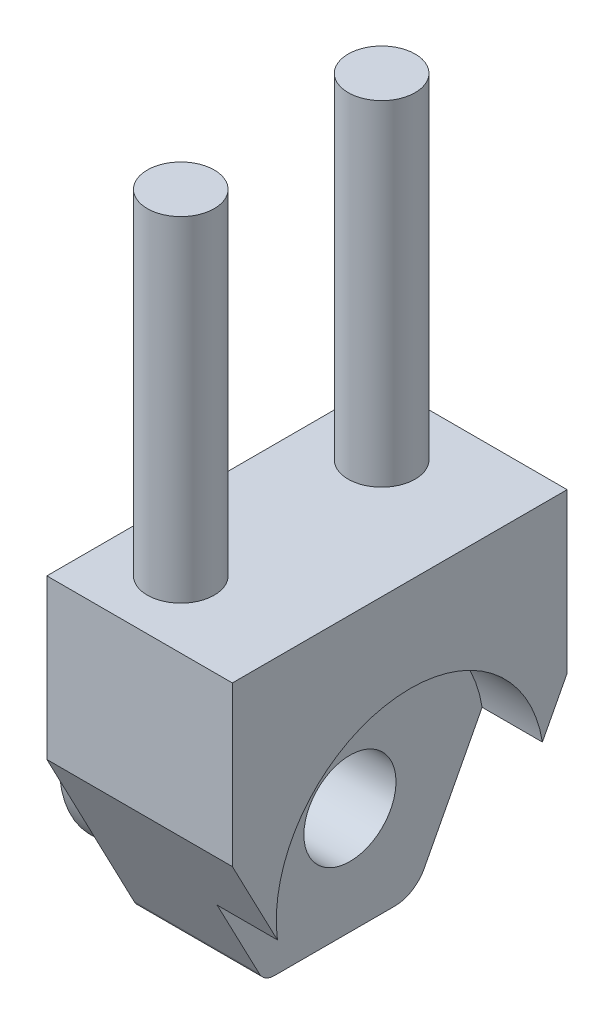
ISO-10303-21;
HEADER;
FILE_DESCRIPTION(('STEP AP214'),'2;1');
FILE_NAME('part.step','',(''),(''),'','','');
FILE_SCHEMA(('AUTOMOTIVE_DESIGN { 1 0 10303 214 1 1 1 1 }'));
ENDSEC;
DATA;
#1=APPLICATION_CONTEXT('core data for automotive mechanical design processes');
#2=APPLICATION_PROTOCOL_DEFINITION('international standard','automotive_design',2000,#1);
#3=PRODUCT_CONTEXT('',#1,'mechanical');
#4=PRODUCT('Part','Part','',(#3));
#5=PRODUCT_RELATED_PRODUCT_CATEGORY('part','',(#4));
#6=PRODUCT_DEFINITION_FORMATION('','',#4);
#7=PRODUCT_DEFINITION_CONTEXT('part definition',#1,'design');
#8=PRODUCT_DEFINITION('design','',#6,#7);
#9=PRODUCT_DEFINITION_SHAPE('','',#8);
#10=(LENGTH_UNIT() NAMED_UNIT(*) SI_UNIT(.MILLI.,.METRE.));
#11=(NAMED_UNIT(*) PLANE_ANGLE_UNIT() SI_UNIT($,.RADIAN.));
#12=(NAMED_UNIT(*) SI_UNIT($,.STERADIAN.) SOLID_ANGLE_UNIT());
#13=UNCERTAINTY_MEASURE_WITH_UNIT(LENGTH_MEASURE(1.E-05),#10,'distance_accuracy_value','');
#14=(GEOMETRIC_REPRESENTATION_CONTEXT(3) GLOBAL_UNCERTAINTY_ASSIGNED_CONTEXT((#13)) GLOBAL_UNIT_ASSIGNED_CONTEXT((#10,
#11,#12)) REPRESENTATION_CONTEXT('',''));
#15=CARTESIAN_POINT('',(0.,0.,0.));
#16=DIRECTION('',(0.,0.,1.));
#17=DIRECTION('',(1.,0.,0.));
#18=AXIS2_PLACEMENT_3D('',#15,#16,#17);
#19=CARTESIAN_POINT('',(30.7741068663053,12.8,-1.61793004647283));
#20=DIRECTION('',(1.,0.,0.));
#21=DIRECTION('',(0.,0.,1.));
#22=AXIS2_PLACEMENT_3D('',#19,#20,#21);
#23=PLANE('',#22);
#24=DIRECTION('',(0.,0.,1.));
#25=VECTOR('',#24,1.);
#26=CARTESIAN_POINT('',(30.7741068663053,0.,0.));
#27=LINE('',#26,#25);
#28=CARTESIAN_POINT('',(30.7741068663053,0.,-6.94763686889959));
#29=VERTEX_POINT('',#28);
#30=CARTESIAN_POINT('',(30.7741068663053,0.,7.42192336474054));
#31=VERTEX_POINT('',#30);
#32=EDGE_CURVE('E230',#29,#31,#27,.T.);
#33=ORIENTED_EDGE('',*,*,#32,.F.);
#34=CARTESIAN_POINT('',(30.7741068663053,4.,-6.94763686889959));
#35=DIRECTION('',(-1.,0.,0.));
#36=DIRECTION('',(0.,0.,1.));
#37=AXIS2_PLACEMENT_3D('',#34,#35,#36);
#38=CIRCLE('',#37,4.);
#39=CARTESIAN_POINT('',(30.7741068663053,2.14397202131778,-10.4909630100202));
#40=VERTEX_POINT('',#39);
#41=EDGE_CURVE('E162',#29,#40,#38,.F.);
#42=ORIENTED_EDGE('',*,*,#41,.T.);
#43=DIRECTION('',(0.,-0.885831535280157,0.464006994670556));
#44=VECTOR('',#43,1.);
#45=CARTESIAN_POINT('',(30.7741068663053,21.0000000000001,-20.3679300464728));
#46=LINE('',#45,#44);
#47=CARTESIAN_POINT('',(30.7741068663053,15.3573140445786,-17.4122374031568));
#48=VERTEX_POINT('',#47);
#49=EDGE_CURVE('E202',#40,#48,#46,.F.);
#50=ORIENTED_EDGE('',*,*,#49,.T.);
#51=CARTESIAN_POINT('',(30.7741068663053,12.8,-1.61793004647283));
#52=DIRECTION('',(-1.,0.,0.));
#53=DIRECTION('',(0.,0.,1.));
#54=AXIS2_PLACEMENT_3D('',#51,#52,#53);
#55=CIRCLE('',#54,16.);
#56=CARTESIAN_POINT('',(30.7741068663053,10.7174168179879,14.2459549534255));
#57=VERTEX_POINT('',#56);
#58=EDGE_CURVE('E117',#57,#48,#55,.T.);
#59=ORIENTED_EDGE('',*,*,#58,.F.);
#60=DIRECTION('',(0.,0.885831535280156,0.464006994670556));
#61=VECTOR('',#60,1.);
#62=CARTESIAN_POINT('',(30.7741068663053,21.0000000000001,19.6320699535272));
#63=LINE('',#62,#61);
#64=CARTESIAN_POINT('',(30.7741068663053,1.07198601065888,9.19358643530085));
#65=VERTEX_POINT('',#64);
#66=EDGE_CURVE('E123',#57,#65,#63,.F.);
#67=ORIENTED_EDGE('',*,*,#66,.T.);
#68=CARTESIAN_POINT('',(30.7741068663053,2.,7.42192336474054));
#69=DIRECTION('',(-1.,0.,0.));
#70=DIRECTION('',(0.,0.,1.));
#71=AXIS2_PLACEMENT_3D('',#68,#69,#70);
#72=CIRCLE('',#71,2.);
#73=EDGE_CURVE('E169',#31,#65,#72,.T.);
#74=ORIENTED_EDGE('',*,*,#73,.F.);
#75=EDGE_LOOP('',(#33,#42,#50,#59,#67,#74));
#76=FACE_BOUND('',#75,.T.);
#77=CARTESIAN_POINT('',(30.7741068663053,12.8,-1.61793004647283));
#78=DIRECTION('',(-1.,0.,0.));
#79=DIRECTION('',(0.,0.,1.));
#80=AXIS2_PLACEMENT_3D('',#77,#78,#79);
#81=CIRCLE('',#80,5.5);
#82=CARTESIAN_POINT('',(30.7741068663053,12.8,3.88206995352717));
#83=VERTEX_POINT('',#82);
#84=EDGE_CURVE('E39',#83,#83,#81,.F.);
#85=ORIENTED_EDGE('',*,*,#84,.F.);
#86=EDGE_LOOP('',(#85));
#87=FACE_BOUND('',#86,.T.);
#88=ADVANCED_FACE('F35',(#76,#87),#23,.T.);
#89=CARTESIAN_POINT('',(0.,0.,0.));
#90=DIRECTION('',(0.,1.,0.));
#91=DIRECTION('',(0.,0.,-1.));
#92=AXIS2_PLACEMENT_3D('',#89,#90,#91);
#93=PLANE('',#92);
#94=DIRECTION('',(0.,0.,-1.));
#95=VECTOR('',#94,1.);
#96=CARTESIAN_POINT('',(15.8141068663053,0.,19.6320699535272));
#97=LINE('',#96,#95);
#98=CARTESIAN_POINT('',(15.8141068663053,0.,7.42192336474054));
#99=VERTEX_POINT('',#98);
#100=CARTESIAN_POINT('',(15.8141068663053,0.,-6.94763686889959));
#101=VERTEX_POINT('',#100);
#102=EDGE_CURVE('E194',#99,#101,#97,.T.);
#103=ORIENTED_EDGE('',*,*,#102,.T.);
#104=DIRECTION('',(1.,0.,0.));
#105=VECTOR('',#104,1.);
#106=CARTESIAN_POINT('',(15.8141068663053,0.,-6.94763686889959));
#107=LINE('',#106,#105);
#108=EDGE_CURVE('E151',#29,#101,#107,.F.);
#109=ORIENTED_EDGE('',*,*,#108,.F.);
#110=ORIENTED_EDGE('',*,*,#32,.T.);
#111=DIRECTION('',(-1.,0.,0.));
#112=VECTOR('',#111,1.);
#113=CARTESIAN_POINT('',(30.7741068663053,0.,7.42192336474054));
#114=LINE('',#113,#112);
#115=EDGE_CURVE('E167',#99,#31,#114,.F.);
#116=ORIENTED_EDGE('',*,*,#115,.F.);
#117=EDGE_LOOP('',(#103,#109,#110,#116));
#118=FACE_BOUND('',#117,.T.);
#119=ADVANCED_FACE('F264',(#118),#93,.F.);
#120=CARTESIAN_POINT('',(15.8141068663053,21.0000000000001,19.6320699535272));
#121=DIRECTION('',(0.,0.464006994670556,-0.885831535280156));
#122=DIRECTION('',(-1.,0.,0.));
#123=AXIS2_PLACEMENT_3D('',#120,#121,#122);
#124=PLANE('',#123);
#125=ORIENTED_EDGE('',*,*,#66,.F.);
#126=DIRECTION('',(1.,0.,0.));
#127=VECTOR('',#126,1.);
#128=CARTESIAN_POINT('',(30.7741068663053,10.7174168179879,14.2459549534255));
#129=LINE('',#128,#127);
#130=CARTESIAN_POINT('',(37.9741068663053,10.7174168179879,14.2459549534255));
#131=VERTEX_POINT('',#130);
#132=EDGE_CURVE('E165',#57,#131,#129,.T.);
#133=ORIENTED_EDGE('',*,*,#132,.T.);
#134=DIRECTION('',(0.,-0.885831535280156,-0.464006994670556));
#135=VECTOR('',#134,1.);
#136=CARTESIAN_POINT('',(37.9741068663053,21.0000000000001,19.6320699535272));
#137=LINE('',#136,#135);
#138=CARTESIAN_POINT('',(37.9741068663053,21.0000000000001,19.6320699535272));
#139=VERTEX_POINT('',#138);
#140=EDGE_CURVE('E131',#131,#139,#137,.F.);
#141=ORIENTED_EDGE('',*,*,#140,.T.);
#142=DIRECTION('',(-1.,0.,0.));
#143=VECTOR('',#142,1.);
#144=CARTESIAN_POINT('',(15.8141068663053,21.0000000000001,19.6320699535272));
#145=LINE('',#144,#143);
#146=CARTESIAN_POINT('',(15.8141068663053,21.0000000000001,19.6320699535272));
#147=VERTEX_POINT('',#146);
#148=EDGE_CURVE('E140',#139,#147,#145,.T.);
#149=ORIENTED_EDGE('',*,*,#148,.T.);
#150=DIRECTION('',(0.,0.885831535280156,0.464006994670556));
#151=VECTOR('',#150,1.);
#152=CARTESIAN_POINT('',(15.8141068663053,21.0000000000001,19.6320699535272));
#153=LINE('',#152,#151);
#154=CARTESIAN_POINT('',(15.8141068663053,1.07198601065888,9.19358643530085));
#155=VERTEX_POINT('',#154);
#156=EDGE_CURVE('E148',#147,#155,#153,.F.);
#157=ORIENTED_EDGE('',*,*,#156,.T.);
#158=DIRECTION('',(1.,0.,0.));
#159=VECTOR('',#158,1.);
#160=CARTESIAN_POINT('',(15.8141068663053,1.07198601065889,9.19358643530085));
#161=LINE('',#160,#159);
#162=EDGE_CURVE('E44',#65,#155,#161,.F.);
#163=ORIENTED_EDGE('',*,*,#162,.F.);
#164=EDGE_LOOP('',(#125,#133,#141,#149,#157,#163));
#165=FACE_BOUND('',#164,.T.);
#166=ADVANCED_FACE('F175',(#165),#124,.F.);
#167=CARTESIAN_POINT('',(37.9741068663053,40.,19.6320699535272));
#168=DIRECTION('',(-1.,0.,0.));
#169=DIRECTION('',(0.,0.,-1.));
#170=AXIS2_PLACEMENT_3D('',#167,#168,#169);
#171=PLANE('',#170);
#172=DIRECTION('',(0.,0.885831535280157,-0.464006994670556));
#173=VECTOR('',#172,1.);
#174=CARTESIAN_POINT('',(37.9741068663053,21.0000000000001,-20.3679300464728));
#175=LINE('',#174,#173);
#176=CARTESIAN_POINT('',(37.9741068663053,21.0000000000002,-20.3679300464728));
#177=VERTEX_POINT('',#176);
#178=CARTESIAN_POINT('',(37.9741068663053,15.3573140445786,-17.4122374031568));
#179=VERTEX_POINT('',#178);
#180=EDGE_CURVE('E129',#177,#179,#175,.F.);
#181=ORIENTED_EDGE('',*,*,#180,.F.);
#182=DIRECTION('',(0.,-1.,0.));
#183=VECTOR('',#182,1.);
#184=CARTESIAN_POINT('',(37.9741068663053,40.,-20.3679300464728));
#185=LINE('',#184,#183);
#186=CARTESIAN_POINT('',(37.9741068663053,40.,-20.3679300464728));
#187=VERTEX_POINT('',#186);
#188=EDGE_CURVE('E189',#187,#177,#185,.T.);
#189=ORIENTED_EDGE('',*,*,#188,.F.);
#190=DIRECTION('',(0.,0.,1.));
#191=VECTOR('',#190,1.);
#192=CARTESIAN_POINT('',(37.9741068663053,40.,19.6320699535272));
#193=LINE('',#192,#191);
#194=CARTESIAN_POINT('',(37.9741068663053,40.,19.6320699535272));
#195=VERTEX_POINT('',#194);
#196=EDGE_CURVE('E191',#187,#195,#193,.T.);
#197=ORIENTED_EDGE('',*,*,#196,.T.);
#198=DIRECTION('',(0.,-1.,0.));
#199=VECTOR('',#198,1.);
#200=CARTESIAN_POINT('',(37.9741068663053,40.,19.6320699535272));
#201=LINE('',#200,#199);
#202=EDGE_CURVE('E186',#195,#139,#201,.T.);
#203=ORIENTED_EDGE('',*,*,#202,.T.);
#204=ORIENTED_EDGE('',*,*,#140,.F.);
#205=CARTESIAN_POINT('',(37.9741068663053,12.8,-1.61793004647283));
#206=DIRECTION('',(-1.,0.,0.));
#207=DIRECTION('',(0.,0.,1.));
#208=AXIS2_PLACEMENT_3D('',#205,#206,#207);
#209=CIRCLE('',#208,16.);
#210=EDGE_CURVE('E114',#131,#179,#209,.T.);
#211=ORIENTED_EDGE('',*,*,#210,.T.);
#212=EDGE_LOOP('',(#181,#189,#197,#203,#204,#211));
#213=FACE_BOUND('',#212,.T.);
#214=ADVANCED_FACE('F127',(#213),#171,.F.);
#215=CARTESIAN_POINT('',(0.,4.,-6.94763686889959));
#216=DIRECTION('',(-1.,0.,0.));
#217=DIRECTION('',(0.,0.,-1.));
#218=AXIS2_PLACEMENT_3D('',#215,#216,#217);
#219=CYLINDRICAL_SURFACE('',#218,4.);
#220=ORIENTED_EDGE('',*,*,#108,.T.);
#221=CARTESIAN_POINT('',(15.8141068663053,4.,-6.94763686889959));
#222=DIRECTION('',(-1.,0.,0.));
#223=DIRECTION('',(0.,0.,1.));
#224=AXIS2_PLACEMENT_3D('',#221,#222,#223);
#225=CIRCLE('',#224,4.);
#226=CARTESIAN_POINT('',(15.8141068663053,2.14397202131777,-10.4909630100202));
#227=VERTEX_POINT('',#226);
#228=EDGE_CURVE('E154',#101,#227,#225,.F.);
#229=ORIENTED_EDGE('',*,*,#228,.T.);
#230=DIRECTION('',(-1.,0.,0.));
#231=VECTOR('',#230,1.);
#232=CARTESIAN_POINT('',(37.9741068663053,2.14397202131778,-10.4909630100202));
#233=LINE('',#232,#231);
#234=EDGE_CURVE('E157',#227,#40,#233,.F.);
#235=ORIENTED_EDGE('',*,*,#234,.T.);
#236=ORIENTED_EDGE('',*,*,#41,.F.);
#237=EDGE_LOOP('',(#220,#229,#235,#236));
#238=FACE_BOUND('',#237,.T.);
#239=ADVANCED_FACE('F205',(#238),#219,.T.);
#240=CARTESIAN_POINT('',(15.8141068663053,40.,19.6320699535272));
#241=DIRECTION('',(1.,0.,0.));
#242=DIRECTION('',(0.,0.,1.));
#243=AXIS2_PLACEMENT_3D('',#240,#241,#242);
#244=PLANE('',#243);
#245=ORIENTED_EDGE('',*,*,#156,.F.);
#246=DIRECTION('',(0.,-1.,0.));
#247=VECTOR('',#246,1.);
#248=CARTESIAN_POINT('',(15.8141068663053,40.,19.6320699535272));
#249=LINE('',#248,#247);
#250=CARTESIAN_POINT('',(15.8141068663053,40.,19.6320699535272));
#251=VERTEX_POINT('',#250);
#252=EDGE_CURVE('E181',#251,#147,#249,.T.);
#253=ORIENTED_EDGE('',*,*,#252,.F.);
#254=DIRECTION('',(0.,0.,-1.));
#255=VECTOR('',#254,1.);
#256=CARTESIAN_POINT('',(15.8141068663053,40.,19.6320699535272));
#257=LINE('',#256,#255);
#258=CARTESIAN_POINT('',(15.8141068663053,40.,-20.3679300464728));
#259=VERTEX_POINT('',#258);
#260=EDGE_CURVE('E184',#251,#259,#257,.T.);
#261=ORIENTED_EDGE('',*,*,#260,.T.);
#262=DIRECTION('',(0.,-1.,0.));
#263=VECTOR('',#262,1.);
#264=CARTESIAN_POINT('',(15.8141068663053,40.,-20.3679300464728));
#265=LINE('',#264,#263);
#266=CARTESIAN_POINT('',(15.8141068663053,21.0000000000002,-20.3679300464728));
#267=VERTEX_POINT('',#266);
#268=EDGE_CURVE('E142',#259,#267,#265,.T.);
#269=ORIENTED_EDGE('',*,*,#268,.T.);
#270=DIRECTION('',(0.,-0.885831535280157,0.464006994670556));
#271=VECTOR('',#270,1.);
#272=CARTESIAN_POINT('',(15.8141068663053,21.0000000000001,-20.3679300464728));
#273=LINE('',#272,#271);
#274=EDGE_CURVE('E138',#227,#267,#273,.F.);
#275=ORIENTED_EDGE('',*,*,#274,.F.);
#276=ORIENTED_EDGE('',*,*,#228,.F.);
#277=ORIENTED_EDGE('',*,*,#102,.F.);
#278=CARTESIAN_POINT('',(15.8141068663053,2.,7.42192336474054));
#279=DIRECTION('',(-1.,0.,0.));
#280=DIRECTION('',(0.,0.,1.));
#281=AXIS2_PLACEMENT_3D('',#278,#279,#280);
#282=CIRCLE('',#281,2.);
#283=EDGE_CURVE('E11',#155,#99,#282,.F.);
#284=ORIENTED_EDGE('',*,*,#283,.F.);
#285=EDGE_LOOP('',(#245,#253,#261,#269,#275,#276,#277,#284));
#286=FACE_BOUND('',#285,.T.);
#287=CARTESIAN_POINT('',(15.8141068663053,13.5,-0.367930046472834));
#288=DIRECTION('',(-1.,0.,0.));
#289=DIRECTION('',(0.,0.,1.));
#290=AXIS2_PLACEMENT_3D('',#287,#288,#289);
#291=CIRCLE('',#290,12.5);
#292=CARTESIAN_POINT('',(15.8141068663053,13.5,12.1320699535272));
#293=VERTEX_POINT('',#292);
#294=EDGE_CURVE('E159',#293,#293,#291,.F.);
#295=ORIENTED_EDGE('',*,*,#294,.T.);
#296=EDGE_LOOP('',(#295));
#297=FACE_BOUND('',#296,.T.);
#298=ADVANCED_FACE('F178',(#286,#297),#244,.F.);
#299=CARTESIAN_POINT('',(0.,40.,0.));
#300=DIRECTION('',(0.,1.,0.));
#301=DIRECTION('',(0.,0.,-1.));
#302=AXIS2_PLACEMENT_3D('',#299,#300,#301);
#303=PLANE('',#302);
#304=CARTESIAN_POINT('',(23.8141068663053,40.,11.6320699535272));
#305=DIRECTION('',(0.,-1.,0.));
#306=DIRECTION('',(0.,0.,-1.));
#307=AXIS2_PLACEMENT_3D('',#304,#305,#306);
#308=CIRCLE('',#307,4.);
#309=CARTESIAN_POINT('',(23.8141068663053,40.,7.63206995352717));
#310=VERTEX_POINT('',#309);
#311=EDGE_CURVE('E211',#310,#310,#308,.T.);
#312=ORIENTED_EDGE('',*,*,#311,.T.);
#313=EDGE_LOOP('',(#312));
#314=FACE_BOUND('',#313,.T.);
#315=ORIENTED_EDGE('',*,*,#260,.F.);
#316=DIRECTION('',(-1.,0.,0.));
#317=VECTOR('',#316,1.);
#318=CARTESIAN_POINT('',(15.8141068663053,40.,19.6320699535272));
#319=LINE('',#318,#317);
#320=EDGE_CURVE('E187',#195,#251,#319,.T.);
#321=ORIENTED_EDGE('',*,*,#320,.F.);
#322=ORIENTED_EDGE('',*,*,#196,.F.);
#323=DIRECTION('',(1.,0.,0.));
#324=VECTOR('',#323,1.);
#325=CARTESIAN_POINT('',(15.8141068663053,40.,-20.3679300464728));
#326=LINE('',#325,#324);
#327=EDGE_CURVE('E200',#259,#187,#326,.T.);
#328=ORIENTED_EDGE('',*,*,#327,.F.);
#329=EDGE_LOOP('',(#315,#321,#322,#328));
#330=FACE_BOUND('',#329,.T.);
#331=CARTESIAN_POINT('',(23.8141068663053,40.,-12.3679300464728));
#332=DIRECTION('',(0.,-1.,0.));
#333=DIRECTION('',(0.,0.,-1.));
#334=AXIS2_PLACEMENT_3D('',#331,#332,#333);
#335=CIRCLE('',#334,4.);
#336=CARTESIAN_POINT('',(23.8141068663053,40.,-16.3679300464728));
#337=VERTEX_POINT('',#336);
#338=EDGE_CURVE('E219',#337,#337,#335,.T.);
#339=ORIENTED_EDGE('',*,*,#338,.T.);
#340=EDGE_LOOP('',(#339));
#341=FACE_BOUND('',#340,.T.);
#342=ADVANCED_FACE('F226',(#314,#330,#341),#303,.T.);
#343=CARTESIAN_POINT('',(15.8141068663053,40.,-20.3679300464728));
#344=DIRECTION('',(0.,0.,1.));
#345=DIRECTION('',(-1.,0.,0.));
#346=AXIS2_PLACEMENT_3D('',#343,#344,#345);
#347=PLANE('',#346);
#348=ORIENTED_EDGE('',*,*,#268,.F.);
#349=ORIENTED_EDGE('',*,*,#327,.T.);
#350=ORIENTED_EDGE('',*,*,#188,.T.);
#351=DIRECTION('',(1.,0.,0.));
#352=VECTOR('',#351,1.);
#353=CARTESIAN_POINT('',(15.8141068663053,21.0000000000001,-20.3679300464728));
#354=LINE('',#353,#352);
#355=EDGE_CURVE('E136',#267,#177,#354,.T.);
#356=ORIENTED_EDGE('',*,*,#355,.F.);
#357=EDGE_LOOP('',(#348,#349,#350,#356));
#358=FACE_BOUND('',#357,.T.);
#359=ADVANCED_FACE('F199',(#358),#347,.F.);
#360=CARTESIAN_POINT('',(15.8141068663053,40.,19.6320699535272));
#361=DIRECTION('',(0.,0.,-1.));
#362=DIRECTION('',(1.,0.,0.));
#363=AXIS2_PLACEMENT_3D('',#360,#361,#362);
#364=PLANE('',#363);
#365=ORIENTED_EDGE('',*,*,#202,.F.);
#366=ORIENTED_EDGE('',*,*,#320,.T.);
#367=ORIENTED_EDGE('',*,*,#252,.T.);
#368=ORIENTED_EDGE('',*,*,#148,.F.);
#369=EDGE_LOOP('',(#365,#366,#367,#368));
#370=FACE_BOUND('',#369,.T.);
#371=ADVANCED_FACE('F228',(#370),#364,.F.);
#372=CARTESIAN_POINT('',(15.8141068663053,21.0000000000001,-20.3679300464728));
#373=DIRECTION('',(0.,0.464006994670556,0.885831535280156));
#374=DIRECTION('',(1.,0.,0.));
#375=AXIS2_PLACEMENT_3D('',#372,#373,#374);
#376=PLANE('',#375);
#377=DIRECTION('',(1.,0.,0.));
#378=VECTOR('',#377,1.);
#379=CARTESIAN_POINT('',(30.7741068663053,15.3573140445786,-17.4122374031568));
#380=LINE('',#379,#378);
#381=EDGE_CURVE('E111',#179,#48,#380,.F.);
#382=ORIENTED_EDGE('',*,*,#381,.T.);
#383=ORIENTED_EDGE('',*,*,#49,.F.);
#384=ORIENTED_EDGE('',*,*,#234,.F.);
#385=ORIENTED_EDGE('',*,*,#274,.T.);
#386=ORIENTED_EDGE('',*,*,#355,.T.);
#387=ORIENTED_EDGE('',*,*,#180,.T.);
#388=EDGE_LOOP('',(#382,#383,#384,#385,#386,#387));
#389=FACE_BOUND('',#388,.T.);
#390=ADVANCED_FACE('F134',(#389),#376,.F.);
#391=CARTESIAN_POINT('',(23.8141068663053,80.,11.6320699535272));
#392=DIRECTION('',(0.,-1.,0.));
#393=DIRECTION('',(0.,0.,1.));
#394=AXIS2_PLACEMENT_3D('',#391,#392,#393);
#395=CYLINDRICAL_SURFACE('',#394,4.);
#396=CARTESIAN_POINT('',(23.8141068663053,80.,11.6320699535272));
#397=DIRECTION('',(0.,-1.,0.));
#398=DIRECTION('',(0.,0.,-1.));
#399=AXIS2_PLACEMENT_3D('',#396,#397,#398);
#400=CIRCLE('',#399,4.);
#401=CARTESIAN_POINT('',(23.8141068663053,80.,7.63206995352717));
#402=VERTEX_POINT('',#401);
#403=EDGE_CURVE('E208',#402,#402,#400,.T.);
#404=ORIENTED_EDGE('',*,*,#403,.T.);
#405=EDGE_LOOP('',(#404));
#406=FACE_BOUND('',#405,.T.);
#407=ORIENTED_EDGE('',*,*,#311,.F.);
#408=EDGE_LOOP('',(#407));
#409=FACE_BOUND('',#408,.T.);
#410=ADVANCED_FACE('F260',(#406,#409),#395,.T.);
#411=CARTESIAN_POINT('',(23.8141068663053,80.,11.6320699535272));
#412=DIRECTION('',(0.,1.,0.));
#413=DIRECTION('',(0.,0.,-1.));
#414=AXIS2_PLACEMENT_3D('',#411,#412,#413);
#415=PLANE('',#414);
#416=ORIENTED_EDGE('',*,*,#403,.F.);
#417=EDGE_LOOP('',(#416));
#418=FACE_BOUND('',#417,.T.);
#419=ADVANCED_FACE('F251',(#418),#415,.T.);
#420=CARTESIAN_POINT('',(23.8141068663053,80.,-12.3679300464728));
#421=DIRECTION('',(0.,-1.,0.));
#422=DIRECTION('',(0.,0.,1.));
#423=AXIS2_PLACEMENT_3D('',#420,#421,#422);
#424=CYLINDRICAL_SURFACE('',#423,4.);
#425=CARTESIAN_POINT('',(23.8141068663053,80.,-12.3679300464728));
#426=DIRECTION('',(0.,-1.,0.));
#427=DIRECTION('',(0.,0.,-1.));
#428=AXIS2_PLACEMENT_3D('',#425,#426,#427);
#429=CIRCLE('',#428,4.);
#430=CARTESIAN_POINT('',(23.8141068663053,80.,-16.3679300464728));
#431=VERTEX_POINT('',#430);
#432=EDGE_CURVE('E216',#431,#431,#429,.T.);
#433=ORIENTED_EDGE('',*,*,#432,.T.);
#434=EDGE_LOOP('',(#433));
#435=FACE_BOUND('',#434,.T.);
#436=ORIENTED_EDGE('',*,*,#338,.F.);
#437=EDGE_LOOP('',(#436));
#438=FACE_BOUND('',#437,.T.);
#439=ADVANCED_FACE('F248',(#435,#438),#424,.T.);
#440=CARTESIAN_POINT('',(23.8141068663053,80.,-12.3679300464728));
#441=DIRECTION('',(0.,1.,0.));
#442=DIRECTION('',(0.,0.,-1.));
#443=AXIS2_PLACEMENT_3D('',#440,#441,#442);
#444=PLANE('',#443);
#445=ORIENTED_EDGE('',*,*,#432,.F.);
#446=EDGE_LOOP('',(#445));
#447=FACE_BOUND('',#446,.T.);
#448=ADVANCED_FACE('F250',(#447),#444,.T.);
#449=CARTESIAN_POINT('',(9.81410686630526,13.5,-0.367930046472835));
#450=DIRECTION('',(1.,0.,0.));
#451=DIRECTION('',(0.,0.,1.));
#452=AXIS2_PLACEMENT_3D('',#449,#450,#451);
#453=CYLINDRICAL_SURFACE('',#452,12.5);
#454=CARTESIAN_POINT('',(9.81410686630526,13.5,-0.367930046472835));
#455=DIRECTION('',(1.,0.,0.));
#456=DIRECTION('',(0.,0.,-1.));
#457=AXIS2_PLACEMENT_3D('',#454,#455,#456);
#458=CIRCLE('',#457,12.5);
#459=CARTESIAN_POINT('',(9.81410686630526,13.5,-12.8679300464728));
#460=VERTEX_POINT('',#459);
#461=EDGE_CURVE('E122',#460,#460,#458,.T.);
#462=ORIENTED_EDGE('',*,*,#461,.T.);
#463=EDGE_LOOP('',(#462));
#464=FACE_BOUND('',#463,.T.);
#465=ORIENTED_EDGE('',*,*,#294,.F.);
#466=EDGE_LOOP('',(#465));
#467=FACE_BOUND('',#466,.T.);
#468=ADVANCED_FACE('F257',(#464,#467),#453,.T.);
#469=CARTESIAN_POINT('',(9.81410686630526,13.5,-0.367930046472835));
#470=DIRECTION('',(-1.,0.,0.));
#471=DIRECTION('',(0.,0.,-1.));
#472=AXIS2_PLACEMENT_3D('',#469,#470,#471);
#473=PLANE('',#472);
#474=ORIENTED_EDGE('',*,*,#461,.F.);
#475=EDGE_LOOP('',(#474));
#476=FACE_BOUND('',#475,.T.);
#477=ADVANCED_FACE('F276',(#476),#473,.T.);
#478=CARTESIAN_POINT('',(30.7741068663053,12.8,-1.61793004647283));
#479=DIRECTION('',(1.,0.,0.));
#480=DIRECTION('',(0.,0.,1.));
#481=AXIS2_PLACEMENT_3D('',#478,#479,#480);
#482=CYLINDRICAL_SURFACE('',#481,16.);
#483=ORIENTED_EDGE('',*,*,#381,.F.);
#484=ORIENTED_EDGE('',*,*,#210,.F.);
#485=ORIENTED_EDGE('',*,*,#132,.F.);
#486=ORIENTED_EDGE('',*,*,#58,.T.);
#487=EDGE_LOOP('',(#483,#484,#485,#486));
#488=FACE_BOUND('',#487,.T.);
#489=ADVANCED_FACE('F113',(#488),#482,.F.);
#490=CARTESIAN_POINT('',(0.,2.,7.42192336474054));
#491=DIRECTION('',(1.,0.,0.));
#492=DIRECTION('',(0.,0.,1.));
#493=AXIS2_PLACEMENT_3D('',#490,#491,#492);
#494=CYLINDRICAL_SURFACE('',#493,2.);
#495=ORIENTED_EDGE('',*,*,#283,.T.);
#496=ORIENTED_EDGE('',*,*,#115,.T.);
#497=ORIENTED_EDGE('',*,*,#73,.T.);
#498=ORIENTED_EDGE('',*,*,#162,.T.);
#499=EDGE_LOOP('',(#495,#496,#497,#498));
#500=FACE_BOUND('',#499,.T.);
#501=ADVANCED_FACE('F37',(#500),#494,.T.);
#502=CARTESIAN_POINT('',(22.9741068663053,12.8,-1.61793004647283));
#503=DIRECTION('',(1.,0.,0.));
#504=DIRECTION('',(0.,0.,1.));
#505=AXIS2_PLACEMENT_3D('',#502,#503,#504);
#506=CYLINDRICAL_SURFACE('',#505,5.5);
#507=ORIENTED_EDGE('',*,*,#84,.T.);
#508=EDGE_LOOP('',(#507));
#509=FACE_BOUND('',#508,.T.);
#510=CARTESIAN_POINT('',(22.9741068663053,12.8,-1.61793004647283));
#511=DIRECTION('',(1.,0.,0.));
#512=DIRECTION('',(0.,0.,-1.));
#513=AXIS2_PLACEMENT_3D('',#510,#511,#512);
#514=CIRCLE('',#513,5.5);
#515=CARTESIAN_POINT('',(22.9741068663053,12.8,-7.11793004647283));
#516=VERTEX_POINT('',#515);
#517=EDGE_CURVE('E237',#516,#516,#514,.T.);
#518=ORIENTED_EDGE('',*,*,#517,.F.);
#519=EDGE_LOOP('',(#518));
#520=FACE_BOUND('',#519,.T.);
#521=ADVANCED_FACE('F272',(#509,#520),#506,.F.);
#522=CARTESIAN_POINT('',(22.9741068663053,12.8,-1.61793004647283));
#523=DIRECTION('',(-1.,0.,0.));
#524=DIRECTION('',(0.,0.,-1.));
#525=AXIS2_PLACEMENT_3D('',#522,#523,#524);
#526=PLANE('',#525);
#527=ORIENTED_EDGE('',*,*,#517,.T.);
#528=EDGE_LOOP('',(#527));
#529=FACE_BOUND('',#528,.T.);
#530=ADVANCED_FACE('F362',(#529),#526,.F.);
#531=CLOSED_SHELL('',(#88,#119,#166,#214,#239,#298,#342,#359,#371,#390,#410,#419,#439,#448,#468,
#477,#489,#501,#521,#530));
#532=MANIFOLD_SOLID_BREP('B2',#531);
#533=ADVANCED_BREP_SHAPE_REPRESENTATION('',(#18,#532),#14);
#534=SHAPE_DEFINITION_REPRESENTATION(#9,#533);
ENDSEC;
END-ISO-10303-21;
